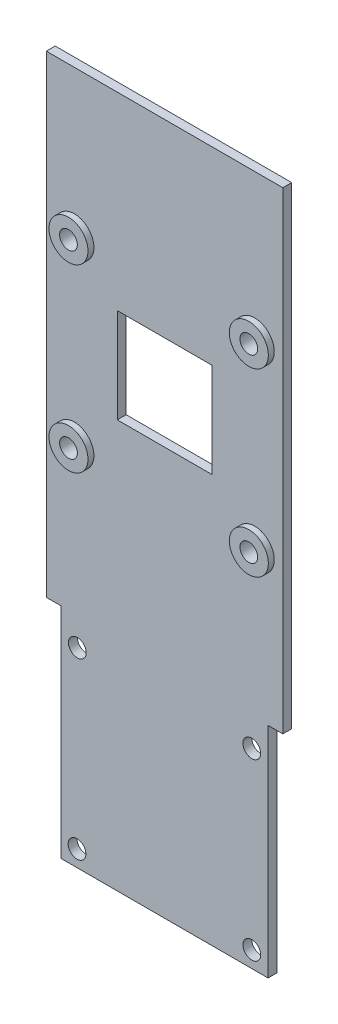
ISO-10303-21;
HEADER;
FILE_DESCRIPTION(('STEP AP214'),'2;1');
FILE_NAME('part.step','',(''),(''),'','','');
FILE_SCHEMA(('AUTOMOTIVE_DESIGN { 1 0 10303 214 1 1 1 1 }'));
ENDSEC;
DATA;
#1=APPLICATION_CONTEXT('core data for automotive mechanical design processes');
#2=APPLICATION_PROTOCOL_DEFINITION('international standard','automotive_design',2000,#1);
#3=PRODUCT_CONTEXT('',#1,'mechanical');
#4=PRODUCT('Part','Part','',(#3));
#5=PRODUCT_RELATED_PRODUCT_CATEGORY('part','',(#4));
#6=PRODUCT_DEFINITION_FORMATION('','',#4);
#7=PRODUCT_DEFINITION_CONTEXT('part definition',#1,'design');
#8=PRODUCT_DEFINITION('design','',#6,#7);
#9=PRODUCT_DEFINITION_SHAPE('','',#8);
#10=(LENGTH_UNIT() NAMED_UNIT(*) SI_UNIT(.MILLI.,.METRE.));
#11=(NAMED_UNIT(*) PLANE_ANGLE_UNIT() SI_UNIT($,.RADIAN.));
#12=(NAMED_UNIT(*) SI_UNIT($,.STERADIAN.) SOLID_ANGLE_UNIT());
#13=UNCERTAINTY_MEASURE_WITH_UNIT(LENGTH_MEASURE(1.E-05),#10,'distance_accuracy_value','');
#14=(GEOMETRIC_REPRESENTATION_CONTEXT(3) GLOBAL_UNCERTAINTY_ASSIGNED_CONTEXT((#13)) GLOBAL_UNIT_ASSIGNED_CONTEXT((#10,
#11,#12)) REPRESENTATION_CONTEXT('',''));
#15=CARTESIAN_POINT('',(0.,0.,0.));
#16=DIRECTION('',(0.,0.,1.));
#17=DIRECTION('',(1.,0.,0.));
#18=AXIS2_PLACEMENT_3D('',#15,#16,#17);
#19=CARTESIAN_POINT('',(0.,0.,1.5));
#20=DIRECTION('',(0.,0.,1.));
#21=DIRECTION('',(1.,0.,0.));
#22=AXIS2_PLACEMENT_3D('',#19,#20,#21);
#23=PLANE('',#22);
#24=CARTESIAN_POINT('',(-2.42106342181394,5.93004624012849,1.5));
#25=DIRECTION('',(0.,0.,1.));
#26=DIRECTION('',(1.,0.,0.));
#27=AXIS2_PLACEMENT_3D('',#24,#25,#26);
#28=CIRCLE('',#27,3.3);
#29=CARTESIAN_POINT('',(0.878936578186062,5.93004624012849,1.5));
#30=VERTEX_POINT('',#29);
#31=EDGE_CURVE('E393',#30,#30,#28,.T.);
#32=ORIENTED_EDGE('',*,*,#31,.F.);
#33=EDGE_LOOP('',(#32));
#34=FACE_BOUND('',#33,.T.);
#35=CARTESIAN_POINT('',(-2.42106342181394,36.4300462401285,1.5));
#36=DIRECTION('',(0.,0.,1.));
#37=DIRECTION('',(1.,0.,0.));
#38=AXIS2_PLACEMENT_3D('',#35,#36,#37);
#39=CIRCLE('',#38,3.3);
#40=CARTESIAN_POINT('',(0.878936578186061,36.4300462401285,1.5));
#41=VERTEX_POINT('',#40);
#42=EDGE_CURVE('E312',#41,#41,#39,.T.);
#43=ORIENTED_EDGE('',*,*,#42,.F.);
#44=EDGE_LOOP('',(#43));
#45=FACE_BOUND('',#44,.T.);
#46=CARTESIAN_POINT('',(-1.97914638313511,-53.0699537598715,1.5));
#47=DIRECTION('',(0.,0.,1.));
#48=DIRECTION('',(-1.,0.,0.));
#49=AXIS2_PLACEMENT_3D('',#46,#47,#48);
#50=CIRCLE('',#49,1.5);
#51=CARTESIAN_POINT('',(-3.47914638313512,-53.0699537598715,1.5));
#52=VERTEX_POINT('',#51);
#53=EDGE_CURVE('E334',#52,#52,#50,.T.);
#54=ORIENTED_EDGE('',*,*,#53,.F.);
#55=EDGE_LOOP('',(#54));
#56=FACE_BOUND('',#55,.T.);
#57=CARTESIAN_POINT('',(-1.92106342181394,-23.5699537598715,1.5));
#58=DIRECTION('',(0.,0.,1.));
#59=DIRECTION('',(-1.,0.,0.));
#60=AXIS2_PLACEMENT_3D('',#57,#58,#59);
#61=CIRCLE('',#60,1.5);
#62=CARTESIAN_POINT('',(-3.42106342181394,-23.5699537598715,1.5));
#63=VERTEX_POINT('',#62);
#64=EDGE_CURVE('E157',#63,#63,#61,.T.);
#65=ORIENTED_EDGE('',*,*,#64,.F.);
#66=EDGE_LOOP('',(#65));
#67=FACE_BOUND('',#66,.T.);
#68=DIRECTION('',(0.,-1.,0.));
#69=VECTOR('',#68,1.);
#70=CARTESIAN_POINT('',(-7.17106342181394,61.1800462401285,1.5));
#71=LINE('',#70,#69);
#72=CARTESIAN_POINT('',(-7.17106342181394,61.1800462401285,1.5));
#73=VERTEX_POINT('',#72);
#74=CARTESIAN_POINT('',(-7.17106342181394,-18.8199537598715,1.5));
#75=VERTEX_POINT('',#74);
#76=EDGE_CURVE('E179',#73,#75,#71,.T.);
#77=ORIENTED_EDGE('',*,*,#76,.T.);
#78=DIRECTION('',(1.,0.,0.));
#79=VECTOR('',#78,1.);
#80=CARTESIAN_POINT('',(-7.17106342181394,-18.8199537598715,1.5));
#81=LINE('',#80,#79);
#82=CARTESIAN_POINT('',(-4.67106342181393,-18.8199537598715,1.5));
#83=VERTEX_POINT('',#82);
#84=EDGE_CURVE('E182',#75,#83,#81,.T.);
#85=ORIENTED_EDGE('',*,*,#84,.T.);
#86=DIRECTION('',(0.,-1.,0.));
#87=VECTOR('',#86,1.);
#88=CARTESIAN_POINT('',(-4.67106342181393,-18.8199537598715,1.5));
#89=LINE('',#88,#87);
#90=CARTESIAN_POINT('',(-4.67106342181394,-55.8199537598715,1.5));
#91=VERTEX_POINT('',#90);
#92=EDGE_CURVE('E185',#83,#91,#89,.T.);
#93=ORIENTED_EDGE('',*,*,#92,.T.);
#94=DIRECTION('',(1.,0.,0.));
#95=VECTOR('',#94,1.);
#96=CARTESIAN_POINT('',(-4.67106342181394,-55.8199537598715,1.5));
#97=LINE('',#96,#95);
#98=CARTESIAN_POINT('',(30.3289365781861,-55.8199537598715,1.5));
#99=VERTEX_POINT('',#98);
#100=EDGE_CURVE('E187',#91,#99,#97,.T.);
#101=ORIENTED_EDGE('',*,*,#100,.T.);
#102=DIRECTION('',(0.,1.,0.));
#103=VECTOR('',#102,1.);
#104=CARTESIAN_POINT('',(30.3289365781861,-55.8199537598715,1.5));
#105=LINE('',#104,#103);
#106=CARTESIAN_POINT('',(30.3289365781861,-18.8199537598715,1.5));
#107=VERTEX_POINT('',#106);
#108=EDGE_CURVE('E189',#99,#107,#105,.T.);
#109=ORIENTED_EDGE('',*,*,#108,.T.);
#110=DIRECTION('',(1.,0.,0.));
#111=VECTOR('',#110,1.);
#112=CARTESIAN_POINT('',(30.3289365781861,-18.8199537598715,1.5));
#113=LINE('',#112,#111);
#114=CARTESIAN_POINT('',(32.8289365781861,-18.8199537598715,1.5));
#115=VERTEX_POINT('',#114);
#116=EDGE_CURVE('E191',#107,#115,#113,.T.);
#117=ORIENTED_EDGE('',*,*,#116,.T.);
#118=DIRECTION('',(0.,1.,0.));
#119=VECTOR('',#118,1.);
#120=CARTESIAN_POINT('',(32.8289365781861,61.1800462401285,1.5));
#121=LINE('',#120,#119);
#122=CARTESIAN_POINT('',(32.8289365781861,61.1800462401285,1.5));
#123=VERTEX_POINT('',#122);
#124=EDGE_CURVE('E193',#115,#123,#121,.T.);
#125=ORIENTED_EDGE('',*,*,#124,.T.);
#126=DIRECTION('',(-1.,0.,0.));
#127=VECTOR('',#126,1.);
#128=CARTESIAN_POINT('',(-7.17106342181394,61.1800462401285,1.5));
#129=LINE('',#128,#127);
#130=EDGE_CURVE('E195',#123,#73,#129,.T.);
#131=ORIENTED_EDGE('',*,*,#130,.T.);
#132=EDGE_LOOP('',(#77,#85,#93,#101,#109,#117,#125,#131));
#133=FACE_BOUND('',#132,.T.);
#134=DIRECTION('',(0.,1.,0.));
#135=VECTOR('',#134,1.);
#136=CARTESIAN_POINT('',(20.8289365781861,13.1800462401285,1.5));
#137=LINE('',#136,#135);
#138=CARTESIAN_POINT('',(20.8289365781861,13.1800462401285,1.5));
#139=VERTEX_POINT('',#138);
#140=CARTESIAN_POINT('',(20.8289365781861,29.1800462401285,1.5));
#141=VERTEX_POINT('',#140);
#142=EDGE_CURVE('E134',#139,#141,#137,.T.);
#143=ORIENTED_EDGE('',*,*,#142,.F.);
#144=DIRECTION('',(1.,0.,0.));
#145=VECTOR('',#144,1.);
#146=CARTESIAN_POINT('',(4.82893657818606,13.1800462401285,1.5));
#147=LINE('',#146,#145);
#148=CARTESIAN_POINT('',(4.82893657818606,13.1800462401285,1.5));
#149=VERTEX_POINT('',#148);
#150=EDGE_CURVE('E126',#149,#139,#147,.T.);
#151=ORIENTED_EDGE('',*,*,#150,.F.);
#152=DIRECTION('',(0.,-1.,0.));
#153=VECTOR('',#152,1.);
#154=CARTESIAN_POINT('',(4.82893657818606,29.1800462401285,1.5));
#155=LINE('',#154,#153);
#156=CARTESIAN_POINT('',(4.82893657818606,29.1800462401285,1.5));
#157=VERTEX_POINT('',#156);
#158=EDGE_CURVE('E150',#157,#149,#155,.T.);
#159=ORIENTED_EDGE('',*,*,#158,.F.);
#160=DIRECTION('',(-1.,0.,0.));
#161=VECTOR('',#160,1.);
#162=CARTESIAN_POINT('',(20.8289365781861,29.1800462401285,1.5));
#163=LINE('',#162,#161);
#164=EDGE_CURVE('E148',#141,#157,#163,.T.);
#165=ORIENTED_EDGE('',*,*,#164,.F.);
#166=EDGE_LOOP('',(#143,#151,#159,#165));
#167=FACE_BOUND('',#166,.T.);
#168=CARTESIAN_POINT('',(27.5789365781861,-23.5699537598715,1.5));
#169=DIRECTION('',(0.,0.,1.));
#170=DIRECTION('',(-1.,0.,0.));
#171=AXIS2_PLACEMENT_3D('',#168,#169,#170);
#172=CIRCLE('',#171,1.5);
#173=CARTESIAN_POINT('',(26.0789365781861,-23.5699537598715,1.5));
#174=VERTEX_POINT('',#173);
#175=EDGE_CURVE('E340',#174,#174,#172,.T.);
#176=ORIENTED_EDGE('',*,*,#175,.F.);
#177=EDGE_LOOP('',(#176));
#178=FACE_BOUND('',#177,.T.);
#179=CARTESIAN_POINT('',(27.5789365781861,-53.0699537598715,1.5));
#180=DIRECTION('',(0.,0.,1.));
#181=DIRECTION('',(-1.,0.,0.));
#182=AXIS2_PLACEMENT_3D('',#179,#180,#181);
#183=CIRCLE('',#182,1.5);
#184=CARTESIAN_POINT('',(26.0789365781861,-53.0699537598715,1.5));
#185=VERTEX_POINT('',#184);
#186=EDGE_CURVE('E328',#185,#185,#183,.T.);
#187=ORIENTED_EDGE('',*,*,#186,.F.);
#188=EDGE_LOOP('',(#187));
#189=FACE_BOUND('',#188,.T.);
#190=CARTESIAN_POINT('',(28.0789365781861,5.93004624012849,1.5));
#191=DIRECTION('',(0.,0.,1.));
#192=DIRECTION('',(1.,0.,0.));
#193=AXIS2_PLACEMENT_3D('',#190,#191,#192);
#194=CIRCLE('',#193,3.30000000000001);
#195=CARTESIAN_POINT('',(31.3789365781861,5.93004624012849,1.5));
#196=VERTEX_POINT('',#195);
#197=EDGE_CURVE('E390',#196,#196,#194,.T.);
#198=ORIENTED_EDGE('',*,*,#197,.F.);
#199=EDGE_LOOP('',(#198));
#200=FACE_BOUND('',#199,.T.);
#201=CARTESIAN_POINT('',(28.0789365781861,36.4300462401285,1.5));
#202=DIRECTION('',(0.,0.,1.));
#203=DIRECTION('',(1.,0.,0.));
#204=AXIS2_PLACEMENT_3D('',#201,#202,#203);
#205=CIRCLE('',#204,3.30000000000001);
#206=CARTESIAN_POINT('',(31.3789365781861,36.4300462401285,1.5));
#207=VERTEX_POINT('',#206);
#208=EDGE_CURVE('E319',#207,#207,#205,.T.);
#209=ORIENTED_EDGE('',*,*,#208,.F.);
#210=EDGE_LOOP('',(#209));
#211=FACE_BOUND('',#210,.T.);
#212=ADVANCED_FACE('F39',(#34,#45,#56,#67,#133,#167,#178,#189,#200,#211),#23,.T.);
#213=CARTESIAN_POINT('',(0.,0.,0.));
#214=DIRECTION('',(0.,0.,1.));
#215=DIRECTION('',(1.,0.,0.));
#216=AXIS2_PLACEMENT_3D('',#213,#214,#215);
#217=PLANE('',#216);
#218=CARTESIAN_POINT('',(-2.42106342181394,5.93004624012849,0.));
#219=DIRECTION('',(0.,0.,1.));
#220=DIRECTION('',(-1.,0.,0.));
#221=AXIS2_PLACEMENT_3D('',#218,#219,#220);
#222=CIRCLE('',#221,1.5);
#223=CARTESIAN_POINT('',(-3.92106342181394,5.93004624012849,0.));
#224=VERTEX_POINT('',#223);
#225=EDGE_CURVE('E143',#224,#224,#222,.T.);
#226=ORIENTED_EDGE('',*,*,#225,.T.);
#227=EDGE_LOOP('',(#226));
#228=FACE_BOUND('',#227,.T.);
#229=CARTESIAN_POINT('',(28.0789365781861,5.93004624012849,0.));
#230=DIRECTION('',(0.,0.,1.));
#231=DIRECTION('',(1.,0.,0.));
#232=AXIS2_PLACEMENT_3D('',#229,#230,#231);
#233=CIRCLE('',#232,1.5);
#234=CARTESIAN_POINT('',(29.5789365781861,5.93004624012849,0.));
#235=VERTEX_POINT('',#234);
#236=EDGE_CURVE('E169',#235,#235,#233,.T.);
#237=ORIENTED_EDGE('',*,*,#236,.T.);
#238=EDGE_LOOP('',(#237));
#239=FACE_BOUND('',#238,.T.);
#240=CARTESIAN_POINT('',(28.0789365781861,36.4300462401285,0.));
#241=DIRECTION('',(0.,0.,1.));
#242=DIRECTION('',(-1.,0.,0.));
#243=AXIS2_PLACEMENT_3D('',#240,#241,#242);
#244=CIRCLE('',#243,1.5);
#245=CARTESIAN_POINT('',(26.5789365781861,36.4300462401285,0.));
#246=VERTEX_POINT('',#245);
#247=EDGE_CURVE('E172',#246,#246,#244,.T.);
#248=ORIENTED_EDGE('',*,*,#247,.T.);
#249=EDGE_LOOP('',(#248));
#250=FACE_BOUND('',#249,.T.);
#251=CARTESIAN_POINT('',(-2.42106342181394,36.4300462401285,0.));
#252=DIRECTION('',(0.,0.,1.));
#253=DIRECTION('',(1.,0.,0.));
#254=AXIS2_PLACEMENT_3D('',#251,#252,#253);
#255=CIRCLE('',#254,1.5);
#256=CARTESIAN_POINT('',(-0.921063421813937,36.4300462401285,0.));
#257=VERTEX_POINT('',#256);
#258=EDGE_CURVE('E175',#257,#257,#255,.T.);
#259=ORIENTED_EDGE('',*,*,#258,.T.);
#260=EDGE_LOOP('',(#259));
#261=FACE_BOUND('',#260,.T.);
#262=DIRECTION('',(0.,-1.,0.));
#263=VECTOR('',#262,1.);
#264=CARTESIAN_POINT('',(-7.17106342181394,61.1800462401285,0.));
#265=LINE('',#264,#263);
#266=CARTESIAN_POINT('',(-7.17106342181394,61.1800462401285,0.));
#267=VERTEX_POINT('',#266);
#268=CARTESIAN_POINT('',(-7.17106342181394,-18.8199537598715,0.));
#269=VERTEX_POINT('',#268);
#270=EDGE_CURVE('E178',#267,#269,#265,.T.);
#271=ORIENTED_EDGE('',*,*,#270,.F.);
#272=DIRECTION('',(-1.,0.,0.));
#273=VECTOR('',#272,1.);
#274=CARTESIAN_POINT('',(-7.17106342181394,61.1800462401285,0.));
#275=LINE('',#274,#273);
#276=CARTESIAN_POINT('',(32.8289365781861,61.1800462401285,0.));
#277=VERTEX_POINT('',#276);
#278=EDGE_CURVE('E183',#277,#267,#275,.T.);
#279=ORIENTED_EDGE('',*,*,#278,.F.);
#280=DIRECTION('',(0.,1.,0.));
#281=VECTOR('',#280,1.);
#282=CARTESIAN_POINT('',(32.8289365781861,61.1800462401285,0.));
#283=LINE('',#282,#281);
#284=CARTESIAN_POINT('',(32.8289365781861,-18.8199537598715,0.));
#285=VERTEX_POINT('',#284);
#286=EDGE_CURVE('E210',#285,#277,#283,.T.);
#287=ORIENTED_EDGE('',*,*,#286,.F.);
#288=DIRECTION('',(1.,0.,0.));
#289=VECTOR('',#288,1.);
#290=CARTESIAN_POINT('',(30.3289365781861,-18.8199537598715,0.));
#291=LINE('',#290,#289);
#292=CARTESIAN_POINT('',(30.3289365781861,-18.8199537598715,0.));
#293=VERTEX_POINT('',#292);
#294=EDGE_CURVE('E208',#293,#285,#291,.T.);
#295=ORIENTED_EDGE('',*,*,#294,.F.);
#296=DIRECTION('',(0.,1.,0.));
#297=VECTOR('',#296,1.);
#298=CARTESIAN_POINT('',(30.3289365781861,-55.8199537598715,0.));
#299=LINE('',#298,#297);
#300=CARTESIAN_POINT('',(30.3289365781861,-55.8199537598715,0.));
#301=VERTEX_POINT('',#300);
#302=EDGE_CURVE('E206',#301,#293,#299,.T.);
#303=ORIENTED_EDGE('',*,*,#302,.F.);
#304=DIRECTION('',(1.,0.,0.));
#305=VECTOR('',#304,1.);
#306=CARTESIAN_POINT('',(-4.67106342181394,-55.8199537598715,0.));
#307=LINE('',#306,#305);
#308=CARTESIAN_POINT('',(-4.67106342181394,-55.8199537598715,0.));
#309=VERTEX_POINT('',#308);
#310=EDGE_CURVE('E204',#309,#301,#307,.T.);
#311=ORIENTED_EDGE('',*,*,#310,.F.);
#312=DIRECTION('',(0.,-1.,0.));
#313=VECTOR('',#312,1.);
#314=CARTESIAN_POINT('',(-4.67106342181393,-18.8199537598715,0.));
#315=LINE('',#314,#313);
#316=CARTESIAN_POINT('',(-4.67106342181393,-18.8199537598715,0.));
#317=VERTEX_POINT('',#316);
#318=EDGE_CURVE('E202',#317,#309,#315,.T.);
#319=ORIENTED_EDGE('',*,*,#318,.F.);
#320=DIRECTION('',(1.,0.,0.));
#321=VECTOR('',#320,1.);
#322=CARTESIAN_POINT('',(-7.17106342181394,-18.8199537598715,0.));
#323=LINE('',#322,#321);
#324=EDGE_CURVE('E200',#269,#317,#323,.T.);
#325=ORIENTED_EDGE('',*,*,#324,.F.);
#326=EDGE_LOOP('',(#271,#279,#287,#295,#303,#311,#319,#325));
#327=FACE_BOUND('',#326,.T.);
#328=DIRECTION('',(1.,0.,0.));
#329=VECTOR('',#328,1.);
#330=CARTESIAN_POINT('',(12.8289365781861,13.1800462401285,0.));
#331=LINE('',#330,#329);
#332=CARTESIAN_POINT('',(4.82893657818606,13.1800462401285,0.));
#333=VERTEX_POINT('',#332);
#334=CARTESIAN_POINT('',(20.8289365781861,13.1800462401285,0.));
#335=VERTEX_POINT('',#334);
#336=EDGE_CURVE('E155',#333,#335,#331,.T.);
#337=ORIENTED_EDGE('',*,*,#336,.T.);
#338=DIRECTION('',(0.,1.,0.));
#339=VECTOR('',#338,1.);
#340=CARTESIAN_POINT('',(20.8289365781861,13.1800462401285,0.));
#341=LINE('',#340,#339);
#342=CARTESIAN_POINT('',(20.8289365781861,29.1800462401285,0.));
#343=VERTEX_POINT('',#342);
#344=EDGE_CURVE('E141',#335,#343,#341,.T.);
#345=ORIENTED_EDGE('',*,*,#344,.T.);
#346=DIRECTION('',(-1.,0.,0.));
#347=VECTOR('',#346,1.);
#348=CARTESIAN_POINT('',(20.8289365781861,29.1800462401285,0.));
#349=LINE('',#348,#347);
#350=CARTESIAN_POINT('',(4.82893657818606,29.1800462401285,0.));
#351=VERTEX_POINT('',#350);
#352=EDGE_CURVE('E159',#343,#351,#349,.T.);
#353=ORIENTED_EDGE('',*,*,#352,.T.);
#354=DIRECTION('',(0.,-1.,0.));
#355=VECTOR('',#354,1.);
#356=CARTESIAN_POINT('',(4.82893657818606,29.1800462401285,0.));
#357=LINE('',#356,#355);
#358=EDGE_CURVE('E135',#351,#333,#357,.T.);
#359=ORIENTED_EDGE('',*,*,#358,.T.);
#360=EDGE_LOOP('',(#337,#345,#353,#359));
#361=FACE_BOUND('',#360,.T.);
#362=CARTESIAN_POINT('',(-1.92106342181394,-23.5699537598715,0.));
#363=DIRECTION('',(0.,0.,1.));
#364=DIRECTION('',(-1.,0.,0.));
#365=AXIS2_PLACEMENT_3D('',#362,#363,#364);
#366=CIRCLE('',#365,1.5);
#367=CARTESIAN_POINT('',(-3.42106342181394,-23.5699537598715,0.));
#368=VERTEX_POINT('',#367);
#369=EDGE_CURVE('E343',#368,#368,#366,.T.);
#370=ORIENTED_EDGE('',*,*,#369,.T.);
#371=EDGE_LOOP('',(#370));
#372=FACE_BOUND('',#371,.T.);
#373=CARTESIAN_POINT('',(27.5789365781861,-23.5699537598715,0.));
#374=DIRECTION('',(0.,0.,1.));
#375=DIRECTION('',(-1.,0.,0.));
#376=AXIS2_PLACEMENT_3D('',#373,#374,#375);
#377=CIRCLE('',#376,1.5);
#378=CARTESIAN_POINT('',(26.0789365781861,-23.5699537598715,0.));
#379=VERTEX_POINT('',#378);
#380=EDGE_CURVE('E337',#379,#379,#377,.T.);
#381=ORIENTED_EDGE('',*,*,#380,.T.);
#382=EDGE_LOOP('',(#381));
#383=FACE_BOUND('',#382,.T.);
#384=CARTESIAN_POINT('',(-1.97914638313511,-53.0699537598715,0.));
#385=DIRECTION('',(0.,0.,1.));
#386=DIRECTION('',(-1.,0.,0.));
#387=AXIS2_PLACEMENT_3D('',#384,#385,#386);
#388=CIRCLE('',#387,1.5);
#389=CARTESIAN_POINT('',(-3.47914638313512,-53.0699537598715,0.));
#390=VERTEX_POINT('',#389);
#391=EDGE_CURVE('E331',#390,#390,#388,.T.);
#392=ORIENTED_EDGE('',*,*,#391,.T.);
#393=EDGE_LOOP('',(#392));
#394=FACE_BOUND('',#393,.T.);
#395=CARTESIAN_POINT('',(27.5789365781861,-53.0699537598715,0.));
#396=DIRECTION('',(0.,0.,1.));
#397=DIRECTION('',(-1.,0.,0.));
#398=AXIS2_PLACEMENT_3D('',#395,#396,#397);
#399=CIRCLE('',#398,1.5);
#400=CARTESIAN_POINT('',(26.0789365781861,-53.0699537598715,0.));
#401=VERTEX_POINT('',#400);
#402=EDGE_CURVE('E326',#401,#401,#399,.T.);
#403=ORIENTED_EDGE('',*,*,#402,.T.);
#404=EDGE_LOOP('',(#403));
#405=FACE_BOUND('',#404,.T.);
#406=ADVANCED_FACE('F240',(#228,#239,#250,#261,#327,#361,#372,#383,#394,#405),#217,.F.);
#407=CARTESIAN_POINT('',(-7.17106342181394,61.1800462401285,1.5));
#408=DIRECTION('',(1.,0.,0.));
#409=DIRECTION('',(0.,0.,-1.));
#410=AXIS2_PLACEMENT_3D('',#407,#408,#409);
#411=PLANE('',#410);
#412=ORIENTED_EDGE('',*,*,#270,.T.);
#413=DIRECTION('',(0.,0.,-1.));
#414=VECTOR('',#413,1.);
#415=CARTESIAN_POINT('',(-7.17106342181394,-18.8199537598715,1.5));
#416=LINE('',#415,#414);
#417=EDGE_CURVE('E11',#75,#269,#416,.T.);
#418=ORIENTED_EDGE('',*,*,#417,.F.);
#419=ORIENTED_EDGE('',*,*,#76,.F.);
#420=DIRECTION('',(0.,0.,-1.));
#421=VECTOR('',#420,1.);
#422=CARTESIAN_POINT('',(-7.17106342181394,61.1800462401285,1.5));
#423=LINE('',#422,#421);
#424=EDGE_CURVE('E197',#73,#267,#423,.T.);
#425=ORIENTED_EDGE('',*,*,#424,.T.);
#426=EDGE_LOOP('',(#412,#418,#419,#425));
#427=FACE_BOUND('',#426,.T.);
#428=ADVANCED_FACE('F41',(#427),#411,.F.);
#429=CARTESIAN_POINT('',(-7.17106342181394,-18.8199537598715,1.5));
#430=DIRECTION('',(0.,1.,0.));
#431=DIRECTION('',(0.,0.,1.));
#432=AXIS2_PLACEMENT_3D('',#429,#430,#431);
#433=PLANE('',#432);
#434=ORIENTED_EDGE('',*,*,#324,.T.);
#435=DIRECTION('',(0.,0.,-1.));
#436=VECTOR('',#435,1.);
#437=CARTESIAN_POINT('',(-4.67106342181393,-18.8199537598715,1.5));
#438=LINE('',#437,#436);
#439=EDGE_CURVE('E47',#83,#317,#438,.T.);
#440=ORIENTED_EDGE('',*,*,#439,.F.);
#441=ORIENTED_EDGE('',*,*,#84,.F.);
#442=ORIENTED_EDGE('',*,*,#417,.T.);
#443=EDGE_LOOP('',(#434,#440,#441,#442));
#444=FACE_BOUND('',#443,.T.);
#445=ADVANCED_FACE('F257',(#444),#433,.F.);
#446=CARTESIAN_POINT('',(-4.67106342181393,-18.8199537598715,1.5));
#447=DIRECTION('',(1.,0.,0.));
#448=DIRECTION('',(0.,1.,0.));
#449=AXIS2_PLACEMENT_3D('',#446,#447,#448);
#450=PLANE('',#449);
#451=ORIENTED_EDGE('',*,*,#318,.T.);
#452=DIRECTION('',(0.,0.,-1.));
#453=VECTOR('',#452,1.);
#454=CARTESIAN_POINT('',(-4.67106342181394,-55.8199537598715,1.5));
#455=LINE('',#454,#453);
#456=EDGE_CURVE('E227',#91,#309,#455,.T.);
#457=ORIENTED_EDGE('',*,*,#456,.F.);
#458=ORIENTED_EDGE('',*,*,#92,.F.);
#459=ORIENTED_EDGE('',*,*,#439,.T.);
#460=EDGE_LOOP('',(#451,#457,#458,#459));
#461=FACE_BOUND('',#460,.T.);
#462=ADVANCED_FACE('F234',(#461),#450,.F.);
#463=CARTESIAN_POINT('',(-4.67106342181394,-55.8199537598715,1.5));
#464=DIRECTION('',(0.,1.,0.));
#465=DIRECTION('',(0.,0.,1.));
#466=AXIS2_PLACEMENT_3D('',#463,#464,#465);
#467=PLANE('',#466);
#468=ORIENTED_EDGE('',*,*,#310,.T.);
#469=DIRECTION('',(0.,0.,-1.));
#470=VECTOR('',#469,1.);
#471=CARTESIAN_POINT('',(30.3289365781861,-55.8199537598715,1.5));
#472=LINE('',#471,#470);
#473=EDGE_CURVE('E224',#99,#301,#472,.T.);
#474=ORIENTED_EDGE('',*,*,#473,.F.);
#475=ORIENTED_EDGE('',*,*,#100,.F.);
#476=ORIENTED_EDGE('',*,*,#456,.T.);
#477=EDGE_LOOP('',(#468,#474,#475,#476));
#478=FACE_BOUND('',#477,.T.);
#479=ADVANCED_FACE('F246',(#478),#467,.F.);
#480=CARTESIAN_POINT('',(30.3289365781861,-55.8199537598715,1.5));
#481=DIRECTION('',(-1.,0.,0.));
#482=DIRECTION('',(0.,0.,1.));
#483=AXIS2_PLACEMENT_3D('',#480,#481,#482);
#484=PLANE('',#483);
#485=ORIENTED_EDGE('',*,*,#302,.T.);
#486=DIRECTION('',(0.,0.,-1.));
#487=VECTOR('',#486,1.);
#488=CARTESIAN_POINT('',(30.3289365781861,-18.8199537598715,1.5));
#489=LINE('',#488,#487);
#490=EDGE_CURVE('E221',#107,#293,#489,.T.);
#491=ORIENTED_EDGE('',*,*,#490,.F.);
#492=ORIENTED_EDGE('',*,*,#108,.F.);
#493=ORIENTED_EDGE('',*,*,#473,.T.);
#494=EDGE_LOOP('',(#485,#491,#492,#493));
#495=FACE_BOUND('',#494,.T.);
#496=ADVANCED_FACE('F250',(#495),#484,.F.);
#497=CARTESIAN_POINT('',(30.3289365781861,-18.8199537598715,1.5));
#498=DIRECTION('',(0.,1.,0.));
#499=DIRECTION('',(0.,0.,1.));
#500=AXIS2_PLACEMENT_3D('',#497,#498,#499);
#501=PLANE('',#500);
#502=ORIENTED_EDGE('',*,*,#294,.T.);
#503=DIRECTION('',(0.,0.,-1.));
#504=VECTOR('',#503,1.);
#505=CARTESIAN_POINT('',(32.8289365781861,-18.8199537598715,1.5));
#506=LINE('',#505,#504);
#507=EDGE_CURVE('E218',#115,#285,#506,.T.);
#508=ORIENTED_EDGE('',*,*,#507,.F.);
#509=ORIENTED_EDGE('',*,*,#116,.F.);
#510=ORIENTED_EDGE('',*,*,#490,.T.);
#511=EDGE_LOOP('',(#502,#508,#509,#510));
#512=FACE_BOUND('',#511,.T.);
#513=ADVANCED_FACE('F270',(#512),#501,.F.);
#514=CARTESIAN_POINT('',(32.8289365781861,61.1800462401285,1.5));
#515=DIRECTION('',(-1.,0.,0.));
#516=DIRECTION('',(0.,0.,1.));
#517=AXIS2_PLACEMENT_3D('',#514,#515,#516);
#518=PLANE('',#517);
#519=ORIENTED_EDGE('',*,*,#286,.T.);
#520=DIRECTION('',(0.,0.,-1.));
#521=VECTOR('',#520,1.);
#522=CARTESIAN_POINT('',(32.8289365781861,61.1800462401285,1.5));
#523=LINE('',#522,#521);
#524=EDGE_CURVE('E215',#123,#277,#523,.T.);
#525=ORIENTED_EDGE('',*,*,#524,.F.);
#526=ORIENTED_EDGE('',*,*,#124,.F.);
#527=ORIENTED_EDGE('',*,*,#507,.T.);
#528=EDGE_LOOP('',(#519,#525,#526,#527));
#529=FACE_BOUND('',#528,.T.);
#530=ADVANCED_FACE('F268',(#529),#518,.F.);
#531=CARTESIAN_POINT('',(-7.17106342181394,61.1800462401285,1.5));
#532=DIRECTION('',(0.,-1.,0.));
#533=DIRECTION('',(0.,0.,-1.));
#534=AXIS2_PLACEMENT_3D('',#531,#532,#533);
#535=PLANE('',#534);
#536=ORIENTED_EDGE('',*,*,#278,.T.);
#537=ORIENTED_EDGE('',*,*,#424,.F.);
#538=ORIENTED_EDGE('',*,*,#130,.F.);
#539=ORIENTED_EDGE('',*,*,#524,.T.);
#540=EDGE_LOOP('',(#536,#537,#538,#539));
#541=FACE_BOUND('',#540,.T.);
#542=ADVANCED_FACE('F263',(#541),#535,.F.);
#543=CARTESIAN_POINT('',(-2.42106342181394,36.4300462401285,1.5));
#544=DIRECTION('',(0.,0.,-1.));
#545=DIRECTION('',(-1.,0.,0.));
#546=AXIS2_PLACEMENT_3D('',#543,#544,#545);
#547=CYLINDRICAL_SURFACE('',#546,1.5);
#548=ORIENTED_EDGE('',*,*,#258,.F.);
#549=EDGE_LOOP('',(#548));
#550=FACE_BOUND('',#549,.T.);
#551=CARTESIAN_POINT('',(-2.42106342181394,36.4300462401285,2.5));
#552=DIRECTION('',(0.,0.,1.));
#553=DIRECTION('',(1.,0.,0.));
#554=AXIS2_PLACEMENT_3D('',#551,#552,#553);
#555=CIRCLE('',#554,1.5);
#556=CARTESIAN_POINT('',(-0.921063421813938,36.4300462401285,2.5));
#557=VERTEX_POINT('',#556);
#558=EDGE_CURVE('E310',#557,#557,#555,.T.);
#559=ORIENTED_EDGE('',*,*,#558,.T.);
#560=EDGE_LOOP('',(#559));
#561=FACE_BOUND('',#560,.T.);
#562=ADVANCED_FACE('F292',(#550,#561),#547,.F.);
#563=CARTESIAN_POINT('',(28.0789365781861,36.4300462401285,1.5));
#564=DIRECTION('',(0.,0.,-1.));
#565=DIRECTION('',(-1.,0.,0.));
#566=AXIS2_PLACEMENT_3D('',#563,#564,#565);
#567=CYLINDRICAL_SURFACE('',#566,1.5);
#568=ORIENTED_EDGE('',*,*,#247,.F.);
#569=EDGE_LOOP('',(#568));
#570=FACE_BOUND('',#569,.T.);
#571=CARTESIAN_POINT('',(28.0789365781861,36.4300462401285,2.5));
#572=DIRECTION('',(0.,0.,1.));
#573=DIRECTION('',(1.,0.,0.));
#574=AXIS2_PLACEMENT_3D('',#571,#572,#573);
#575=CIRCLE('',#574,1.5);
#576=CARTESIAN_POINT('',(29.5789365781861,36.4300462401285,2.5));
#577=VERTEX_POINT('',#576);
#578=EDGE_CURVE('E313',#577,#577,#575,.T.);
#579=ORIENTED_EDGE('',*,*,#578,.T.);
#580=EDGE_LOOP('',(#579));
#581=FACE_BOUND('',#580,.T.);
#582=ADVANCED_FACE('F299',(#570,#581),#567,.F.);
#583=CARTESIAN_POINT('',(28.0789365781861,5.93004624012849,1.5));
#584=DIRECTION('',(0.,0.,-1.));
#585=DIRECTION('',(-1.,0.,0.));
#586=AXIS2_PLACEMENT_3D('',#583,#584,#585);
#587=CYLINDRICAL_SURFACE('',#586,1.5);
#588=ORIENTED_EDGE('',*,*,#236,.F.);
#589=EDGE_LOOP('',(#588));
#590=FACE_BOUND('',#589,.T.);
#591=CARTESIAN_POINT('',(28.0789365781861,5.93004624012849,2.5));
#592=DIRECTION('',(0.,0.,1.));
#593=DIRECTION('',(1.,0.,0.));
#594=AXIS2_PLACEMENT_3D('',#591,#592,#593);
#595=CIRCLE('',#594,1.5);
#596=CARTESIAN_POINT('',(29.5789365781861,5.93004624012849,2.5));
#597=VERTEX_POINT('',#596);
#598=EDGE_CURVE('E387',#597,#597,#595,.T.);
#599=ORIENTED_EDGE('',*,*,#598,.T.);
#600=EDGE_LOOP('',(#599));
#601=FACE_BOUND('',#600,.T.);
#602=ADVANCED_FACE('F304',(#590,#601),#587,.F.);
#603=CARTESIAN_POINT('',(-2.42106342181394,5.93004624012849,1.5));
#604=DIRECTION('',(0.,0.,-1.));
#605=DIRECTION('',(-1.,0.,0.));
#606=AXIS2_PLACEMENT_3D('',#603,#604,#605);
#607=CYLINDRICAL_SURFACE('',#606,1.5);
#608=ORIENTED_EDGE('',*,*,#225,.F.);
#609=EDGE_LOOP('',(#608));
#610=FACE_BOUND('',#609,.T.);
#611=CARTESIAN_POINT('',(-2.42106342181394,5.93004624012849,2.5));
#612=DIRECTION('',(0.,0.,1.));
#613=DIRECTION('',(1.,0.,0.));
#614=AXIS2_PLACEMENT_3D('',#611,#612,#613);
#615=CIRCLE('',#614,1.5);
#616=CARTESIAN_POINT('',(-0.921063421813938,5.93004624012849,2.5));
#617=VERTEX_POINT('',#616);
#618=EDGE_CURVE('E323',#617,#617,#615,.T.);
#619=ORIENTED_EDGE('',*,*,#618,.T.);
#620=EDGE_LOOP('',(#619));
#621=FACE_BOUND('',#620,.T.);
#622=ADVANCED_FACE('F375',(#610,#621),#607,.F.);
#623=CARTESIAN_POINT('',(12.8289365781861,13.1800462401285,1.5));
#624=DIRECTION('',(0.,1.,0.));
#625=DIRECTION('',(-1.,0.,0.));
#626=AXIS2_PLACEMENT_3D('',#623,#624,#625);
#627=PLANE('',#626);
#628=ORIENTED_EDGE('',*,*,#336,.F.);
#629=DIRECTION('',(0.,0.,-1.));
#630=VECTOR('',#629,1.);
#631=CARTESIAN_POINT('',(4.82893657818606,13.1800462401285,1.5));
#632=LINE('',#631,#630);
#633=EDGE_CURVE('E59',#149,#333,#632,.T.);
#634=ORIENTED_EDGE('',*,*,#633,.F.);
#635=ORIENTED_EDGE('',*,*,#150,.T.);
#636=DIRECTION('',(0.,0.,-1.));
#637=VECTOR('',#636,1.);
#638=CARTESIAN_POINT('',(20.8289365781861,13.1800462401285,1.5));
#639=LINE('',#638,#637);
#640=EDGE_CURVE('E129',#139,#335,#639,.T.);
#641=ORIENTED_EDGE('',*,*,#640,.T.);
#642=EDGE_LOOP('',(#628,#634,#635,#641));
#643=FACE_BOUND('',#642,.T.);
#644=ADVANCED_FACE('F128',(#643),#627,.T.);
#645=CARTESIAN_POINT('',(20.8289365781861,13.1800462401285,1.5));
#646=DIRECTION('',(-1.,0.,0.));
#647=DIRECTION('',(0.,0.,1.));
#648=AXIS2_PLACEMENT_3D('',#645,#646,#647);
#649=PLANE('',#648);
#650=ORIENTED_EDGE('',*,*,#344,.F.);
#651=ORIENTED_EDGE('',*,*,#640,.F.);
#652=ORIENTED_EDGE('',*,*,#142,.T.);
#653=DIRECTION('',(0.,0.,-1.));
#654=VECTOR('',#653,1.);
#655=CARTESIAN_POINT('',(20.8289365781861,29.1800462401285,1.5));
#656=LINE('',#655,#654);
#657=EDGE_CURVE('E144',#141,#343,#656,.T.);
#658=ORIENTED_EDGE('',*,*,#657,.T.);
#659=EDGE_LOOP('',(#650,#651,#652,#658));
#660=FACE_BOUND('',#659,.T.);
#661=ADVANCED_FACE('F138',(#660),#649,.T.);
#662=CARTESIAN_POINT('',(20.8289365781861,29.1800462401285,1.5));
#663=DIRECTION('',(0.,-1.,0.));
#664=DIRECTION('',(0.,0.,-1.));
#665=AXIS2_PLACEMENT_3D('',#662,#663,#664);
#666=PLANE('',#665);
#667=ORIENTED_EDGE('',*,*,#352,.F.);
#668=ORIENTED_EDGE('',*,*,#657,.F.);
#669=ORIENTED_EDGE('',*,*,#164,.T.);
#670=DIRECTION('',(0.,0.,-1.));
#671=VECTOR('',#670,1.);
#672=CARTESIAN_POINT('',(4.82893657818606,29.1800462401285,1.5));
#673=LINE('',#672,#671);
#674=EDGE_CURVE('E54',#157,#351,#673,.T.);
#675=ORIENTED_EDGE('',*,*,#674,.T.);
#676=EDGE_LOOP('',(#667,#668,#669,#675));
#677=FACE_BOUND('',#676,.T.);
#678=ADVANCED_FACE('F365',(#677),#666,.T.);
#679=CARTESIAN_POINT('',(4.82893657818606,29.1800462401285,1.5));
#680=DIRECTION('',(1.,0.,0.));
#681=DIRECTION('',(0.,0.,-1.));
#682=AXIS2_PLACEMENT_3D('',#679,#680,#681);
#683=PLANE('',#682);
#684=ORIENTED_EDGE('',*,*,#358,.F.);
#685=ORIENTED_EDGE('',*,*,#674,.F.);
#686=ORIENTED_EDGE('',*,*,#158,.T.);
#687=ORIENTED_EDGE('',*,*,#633,.T.);
#688=EDGE_LOOP('',(#684,#685,#686,#687));
#689=FACE_BOUND('',#688,.T.);
#690=ADVANCED_FACE('F355',(#689),#683,.T.);
#691=CARTESIAN_POINT('',(-1.92106342181394,-23.5699537598715,1.5));
#692=DIRECTION('',(0.,0.,-1.));
#693=DIRECTION('',(-1.,0.,0.));
#694=AXIS2_PLACEMENT_3D('',#691,#692,#693);
#695=CYLINDRICAL_SURFACE('',#694,1.5);
#696=ORIENTED_EDGE('',*,*,#64,.T.);
#697=EDGE_LOOP('',(#696));
#698=FACE_BOUND('',#697,.T.);
#699=ORIENTED_EDGE('',*,*,#369,.F.);
#700=EDGE_LOOP('',(#699));
#701=FACE_BOUND('',#700,.T.);
#702=ADVANCED_FACE('F352',(#698,#701),#695,.F.);
#703=CARTESIAN_POINT('',(27.5789365781861,-23.5699537598715,1.5));
#704=DIRECTION('',(0.,0.,-1.));
#705=DIRECTION('',(-1.,0.,0.));
#706=AXIS2_PLACEMENT_3D('',#703,#704,#705);
#707=CYLINDRICAL_SURFACE('',#706,1.5);
#708=ORIENTED_EDGE('',*,*,#175,.T.);
#709=EDGE_LOOP('',(#708));
#710=FACE_BOUND('',#709,.T.);
#711=ORIENTED_EDGE('',*,*,#380,.F.);
#712=EDGE_LOOP('',(#711));
#713=FACE_BOUND('',#712,.T.);
#714=ADVANCED_FACE('F354',(#710,#713),#707,.F.);
#715=CARTESIAN_POINT('',(-1.97914638313511,-53.0699537598715,1.5));
#716=DIRECTION('',(0.,0.,-1.));
#717=DIRECTION('',(-1.,0.,0.));
#718=AXIS2_PLACEMENT_3D('',#715,#716,#717);
#719=CYLINDRICAL_SURFACE('',#718,1.5);
#720=ORIENTED_EDGE('',*,*,#53,.T.);
#721=EDGE_LOOP('',(#720));
#722=FACE_BOUND('',#721,.T.);
#723=ORIENTED_EDGE('',*,*,#391,.F.);
#724=EDGE_LOOP('',(#723));
#725=FACE_BOUND('',#724,.T.);
#726=ADVANCED_FACE('F362',(#722,#725),#719,.F.);
#727=CARTESIAN_POINT('',(27.5789365781861,-53.0699537598715,1.5));
#728=DIRECTION('',(0.,0.,-1.));
#729=DIRECTION('',(-1.,0.,0.));
#730=AXIS2_PLACEMENT_3D('',#727,#728,#729);
#731=CYLINDRICAL_SURFACE('',#730,1.5);
#732=ORIENTED_EDGE('',*,*,#186,.T.);
#733=EDGE_LOOP('',(#732));
#734=FACE_BOUND('',#733,.T.);
#735=ORIENTED_EDGE('',*,*,#402,.F.);
#736=EDGE_LOOP('',(#735));
#737=FACE_BOUND('',#736,.T.);
#738=ADVANCED_FACE('F413',(#734,#737),#731,.F.);
#739=CARTESIAN_POINT('',(-2.42106342181394,5.93004624012849,2.5));
#740=DIRECTION('',(0.,0.,1.));
#741=DIRECTION('',(1.,0.,0.));
#742=AXIS2_PLACEMENT_3D('',#739,#740,#741);
#743=PLANE('',#742);
#744=CARTESIAN_POINT('',(-2.42106342181394,5.93004624012849,2.5));
#745=DIRECTION('',(0.,0.,1.));
#746=DIRECTION('',(1.,0.,0.));
#747=AXIS2_PLACEMENT_3D('',#744,#745,#746);
#748=CIRCLE('',#747,3.3);
#749=CARTESIAN_POINT('',(0.878936578186062,5.93004624012849,2.5));
#750=VERTEX_POINT('',#749);
#751=EDGE_CURVE('E389',#750,#750,#748,.T.);
#752=ORIENTED_EDGE('',*,*,#751,.T.);
#753=EDGE_LOOP('',(#752));
#754=FACE_BOUND('',#753,.T.);
#755=ORIENTED_EDGE('',*,*,#618,.F.);
#756=EDGE_LOOP('',(#755));
#757=FACE_BOUND('',#756,.T.);
#758=ADVANCED_FACE('F410',(#754,#757),#743,.T.);
#759=CARTESIAN_POINT('',(-2.42106342181394,5.93004624012849,2.5));
#760=DIRECTION('',(0.,0.,-1.));
#761=DIRECTION('',(-1.,0.,0.));
#762=AXIS2_PLACEMENT_3D('',#759,#760,#761);
#763=CYLINDRICAL_SURFACE('',#762,3.3);
#764=ORIENTED_EDGE('',*,*,#751,.F.);
#765=EDGE_LOOP('',(#764));
#766=FACE_BOUND('',#765,.T.);
#767=ORIENTED_EDGE('',*,*,#31,.T.);
#768=EDGE_LOOP('',(#767));
#769=FACE_BOUND('',#768,.T.);
#770=ADVANCED_FACE('F412',(#766,#769),#763,.T.);
#771=CARTESIAN_POINT('',(28.0789365781861,5.93004624012849,2.5));
#772=DIRECTION('',(0.,0.,1.));
#773=DIRECTION('',(1.,0.,0.));
#774=AXIS2_PLACEMENT_3D('',#771,#772,#773);
#775=PLANE('',#774);
#776=CARTESIAN_POINT('',(28.0789365781861,5.93004624012849,2.5));
#777=DIRECTION('',(0.,0.,1.));
#778=DIRECTION('',(1.,0.,0.));
#779=AXIS2_PLACEMENT_3D('',#776,#777,#778);
#780=CIRCLE('',#779,3.30000000000001);
#781=CARTESIAN_POINT('',(31.3789365781861,5.93004624012849,2.5));
#782=VERTEX_POINT('',#781);
#783=EDGE_CURVE('E395',#782,#782,#780,.T.);
#784=ORIENTED_EDGE('',*,*,#783,.T.);
#785=EDGE_LOOP('',(#784));
#786=FACE_BOUND('',#785,.T.);
#787=ORIENTED_EDGE('',*,*,#598,.F.);
#788=EDGE_LOOP('',(#787));
#789=FACE_BOUND('',#788,.T.);
#790=ADVANCED_FACE('F419',(#786,#789),#775,.T.);
#791=CARTESIAN_POINT('',(28.0789365781861,5.93004624012849,2.5));
#792=DIRECTION('',(0.,0.,-1.));
#793=DIRECTION('',(-1.,0.,0.));
#794=AXIS2_PLACEMENT_3D('',#791,#792,#793);
#795=CYLINDRICAL_SURFACE('',#794,3.30000000000001);
#796=ORIENTED_EDGE('',*,*,#783,.F.);
#797=EDGE_LOOP('',(#796));
#798=FACE_BOUND('',#797,.T.);
#799=ORIENTED_EDGE('',*,*,#197,.T.);
#800=EDGE_LOOP('',(#799));
#801=FACE_BOUND('',#800,.T.);
#802=ADVANCED_FACE('F508',(#798,#801),#795,.T.);
#803=CARTESIAN_POINT('',(28.0789365781861,36.4300462401285,2.5));
#804=DIRECTION('',(0.,0.,1.));
#805=DIRECTION('',(1.,0.,0.));
#806=AXIS2_PLACEMENT_3D('',#803,#804,#805);
#807=PLANE('',#806);
#808=CARTESIAN_POINT('',(28.0789365781861,36.4300462401285,2.5));
#809=DIRECTION('',(0.,0.,1.));
#810=DIRECTION('',(1.,0.,0.));
#811=AXIS2_PLACEMENT_3D('',#808,#809,#810);
#812=CIRCLE('',#811,3.30000000000001);
#813=CARTESIAN_POINT('',(31.3789365781861,36.4300462401285,2.5));
#814=VERTEX_POINT('',#813);
#815=EDGE_CURVE('E401',#814,#814,#812,.T.);
#816=ORIENTED_EDGE('',*,*,#815,.T.);
#817=EDGE_LOOP('',(#816));
#818=FACE_BOUND('',#817,.T.);
#819=ORIENTED_EDGE('',*,*,#578,.F.);
#820=EDGE_LOOP('',(#819));
#821=FACE_BOUND('',#820,.T.);
#822=ADVANCED_FACE('F518',(#818,#821),#807,.T.);
#823=CARTESIAN_POINT('',(28.0789365781861,36.4300462401285,2.5));
#824=DIRECTION('',(0.,0.,-1.));
#825=DIRECTION('',(-1.,0.,0.));
#826=AXIS2_PLACEMENT_3D('',#823,#824,#825);
#827=CYLINDRICAL_SURFACE('',#826,3.30000000000001);
#828=ORIENTED_EDGE('',*,*,#815,.F.);
#829=EDGE_LOOP('',(#828));
#830=FACE_BOUND('',#829,.T.);
#831=ORIENTED_EDGE('',*,*,#208,.T.);
#832=EDGE_LOOP('',(#831));
#833=FACE_BOUND('',#832,.T.);
#834=ADVANCED_FACE('F430',(#830,#833),#827,.T.);
#835=CARTESIAN_POINT('',(-2.42106342181394,36.4300462401285,2.5));
#836=DIRECTION('',(0.,0.,1.));
#837=DIRECTION('',(1.,0.,0.));
#838=AXIS2_PLACEMENT_3D('',#835,#836,#837);
#839=PLANE('',#838);
#840=CARTESIAN_POINT('',(-2.42106342181394,36.4300462401285,2.5));
#841=DIRECTION('',(0.,0.,1.));
#842=DIRECTION('',(1.,0.,0.));
#843=AXIS2_PLACEMENT_3D('',#840,#841,#842);
#844=CIRCLE('',#843,3.3);
#845=CARTESIAN_POINT('',(0.878936578186061,36.4300462401285,2.5));
#846=VERTEX_POINT('',#845);
#847=EDGE_CURVE('E316',#846,#846,#844,.T.);
#848=ORIENTED_EDGE('',*,*,#847,.T.);
#849=EDGE_LOOP('',(#848));
#850=FACE_BOUND('',#849,.T.);
#851=ORIENTED_EDGE('',*,*,#558,.F.);
#852=EDGE_LOOP('',(#851));
#853=FACE_BOUND('',#852,.T.);
#854=ADVANCED_FACE('F426',(#850,#853),#839,.T.);
#855=CARTESIAN_POINT('',(-2.42106342181394,36.4300462401285,2.5));
#856=DIRECTION('',(0.,0.,-1.));
#857=DIRECTION('',(-1.,0.,0.));
#858=AXIS2_PLACEMENT_3D('',#855,#856,#857);
#859=CYLINDRICAL_SURFACE('',#858,3.3);
#860=ORIENTED_EDGE('',*,*,#847,.F.);
#861=EDGE_LOOP('',(#860));
#862=FACE_BOUND('',#861,.T.);
#863=ORIENTED_EDGE('',*,*,#42,.T.);
#864=EDGE_LOOP('',(#863));
#865=FACE_BOUND('',#864,.T.);
#866=ADVANCED_FACE('F429',(#862,#865),#859,.T.);
#867=CLOSED_SHELL('',(#212,#406,#428,#445,#462,#479,#496,#513,#530,#542,#562,#582,#602,#622,
#644,#661,#678,#690,#702,#714,#726,#738,#758,#770,#790,#802,#822,#834,#854,#866));
#868=MANIFOLD_SOLID_BREP('B2',#867);
#869=ADVANCED_BREP_SHAPE_REPRESENTATION('',(#18,#868),#14);
#870=SHAPE_DEFINITION_REPRESENTATION(#9,#869);
ENDSEC;
END-ISO-10303-21;
